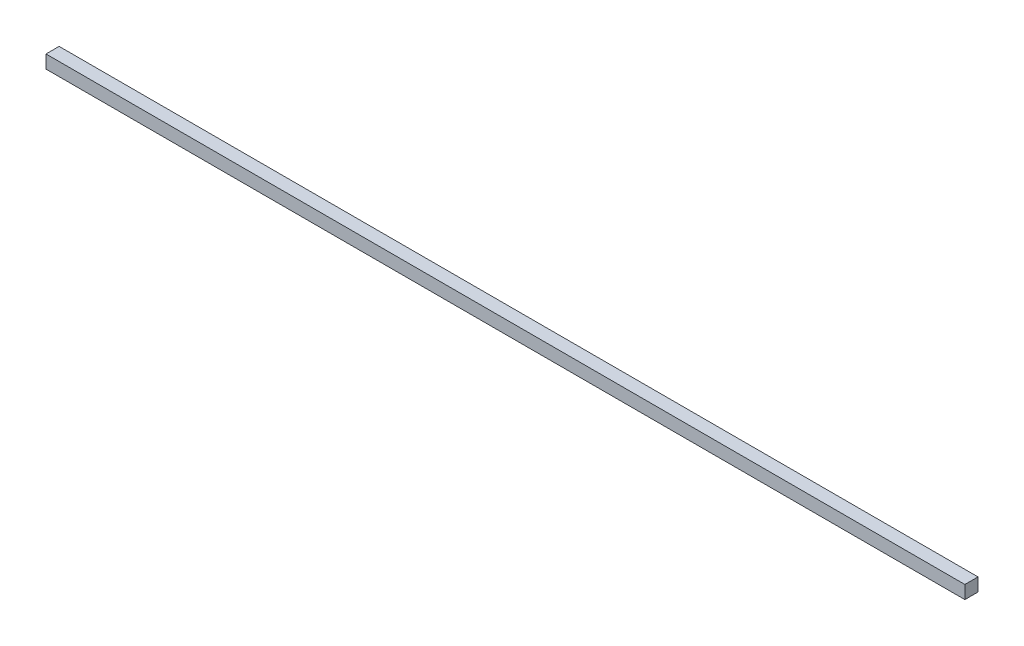
ISO-10303-21;
HEADER;
FILE_DESCRIPTION(('STEP AP214'),'2;1');
FILE_NAME('part.step','',(''),(''),'','','');
FILE_SCHEMA(('AUTOMOTIVE_DESIGN { 1 0 10303 214 1 1 1 1 }'));
ENDSEC;
DATA;
#1=APPLICATION_CONTEXT('core data for automotive mechanical design processes');
#2=APPLICATION_PROTOCOL_DEFINITION('international standard','automotive_design',2000,#1);
#3=PRODUCT_CONTEXT('',#1,'mechanical');
#4=PRODUCT('Part','Part','',(#3));
#5=PRODUCT_RELATED_PRODUCT_CATEGORY('part','',(#4));
#6=PRODUCT_DEFINITION_FORMATION('','',#4);
#7=PRODUCT_DEFINITION_CONTEXT('part definition',#1,'design');
#8=PRODUCT_DEFINITION('design','',#6,#7);
#9=PRODUCT_DEFINITION_SHAPE('','',#8);
#10=(LENGTH_UNIT() NAMED_UNIT(*) SI_UNIT(.MILLI.,.METRE.));
#11=(NAMED_UNIT(*) PLANE_ANGLE_UNIT() SI_UNIT($,.RADIAN.));
#12=(NAMED_UNIT(*) SI_UNIT($,.STERADIAN.) SOLID_ANGLE_UNIT());
#13=UNCERTAINTY_MEASURE_WITH_UNIT(LENGTH_MEASURE(1.E-05),#10,'distance_accuracy_value','');
#14=(GEOMETRIC_REPRESENTATION_CONTEXT(3) GLOBAL_UNCERTAINTY_ASSIGNED_CONTEXT((#13)) GLOBAL_UNIT_ASSIGNED_CONTEXT((#10,
#11,#12)) REPRESENTATION_CONTEXT('',''));
#15=CARTESIAN_POINT('',(0.,0.,0.));
#16=DIRECTION('',(0.,0.,1.));
#17=DIRECTION('',(1.,0.,0.));
#18=AXIS2_PLACEMENT_3D('',#15,#16,#17);
#19=CARTESIAN_POINT('',(-69.9999999999998,2.,1.00000000000001));
#20=DIRECTION('',(1.,0.,0.));
#21=DIRECTION('',(0.,0.,-1.));
#22=AXIS2_PLACEMENT_3D('',#19,#20,#21);
#23=PLANE('',#22);
#24=DIRECTION('',(0.,0.,1.));
#25=VECTOR('',#24,1.);
#26=CARTESIAN_POINT('',(-69.9999999999998,0.,1.00000000000001));
#27=LINE('',#26,#25);
#28=CARTESIAN_POINT('',(-69.9999999999998,0.,-0.999999999999992));
#29=VERTEX_POINT('',#28);
#30=CARTESIAN_POINT('',(-69.9999999999998,0.,1.00000000000001));
#31=VERTEX_POINT('',#30);
#32=EDGE_CURVE('E97',#29,#31,#27,.T.);
#33=ORIENTED_EDGE('',*,*,#32,.T.);
#34=DIRECTION('',(0.,-1.,0.));
#35=VECTOR('',#34,1.);
#36=CARTESIAN_POINT('',(-69.9999999999998,2.,1.00000000000001));
#37=LINE('',#36,#35);
#38=CARTESIAN_POINT('',(-69.9999999999998,2.,1.00000000000001));
#39=VERTEX_POINT('',#38);
#40=EDGE_CURVE('E11',#39,#31,#37,.T.);
#41=ORIENTED_EDGE('',*,*,#40,.F.);
#42=DIRECTION('',(0.,0.,1.));
#43=VECTOR('',#42,1.);
#44=CARTESIAN_POINT('',(-69.9999999999998,2.,1.00000000000001));
#45=LINE('',#44,#43);
#46=CARTESIAN_POINT('',(-69.9999999999998,2.,-0.999999999999992));
#47=VERTEX_POINT('',#46);
#48=EDGE_CURVE('E85',#47,#39,#45,.T.);
#49=ORIENTED_EDGE('',*,*,#48,.F.);
#50=DIRECTION('',(0.,-1.,0.));
#51=VECTOR('',#50,1.);
#52=CARTESIAN_POINT('',(-69.9999999999998,2.,-0.999999999999992));
#53=LINE('',#52,#51);
#54=EDGE_CURVE('E93',#47,#29,#53,.T.);
#55=ORIENTED_EDGE('',*,*,#54,.T.);
#56=EDGE_LOOP('',(#33,#41,#49,#55));
#57=FACE_BOUND('',#56,.T.);
#58=ADVANCED_FACE('F34',(#57),#23,.F.);
#59=CARTESIAN_POINT('',(70.0000000000002,2.,0.999999999999991));
#60=DIRECTION('',(0.,0.,-1.));
#61=DIRECTION('',(-1.,0.,0.));
#62=AXIS2_PLACEMENT_3D('',#59,#60,#61);
#63=PLANE('',#62);
#64=DIRECTION('',(1.,0.,0.));
#65=VECTOR('',#64,1.);
#66=CARTESIAN_POINT('',(70.0000000000002,0.,0.999999999999991));
#67=LINE('',#66,#65);
#68=CARTESIAN_POINT('',(70.0000000000002,0.,0.999999999999991));
#69=VERTEX_POINT('',#68);
#70=EDGE_CURVE('E89',#31,#69,#67,.T.);
#71=ORIENTED_EDGE('',*,*,#70,.T.);
#72=DIRECTION('',(0.,-1.,0.));
#73=VECTOR('',#72,1.);
#74=CARTESIAN_POINT('',(70.0000000000002,2.,0.999999999999991));
#75=LINE('',#74,#73);
#76=CARTESIAN_POINT('',(70.0000000000002,2.,0.999999999999991));
#77=VERTEX_POINT('',#76);
#78=EDGE_CURVE('E42',#77,#69,#75,.T.);
#79=ORIENTED_EDGE('',*,*,#78,.F.);
#80=DIRECTION('',(1.,0.,0.));
#81=VECTOR('',#80,1.);
#82=CARTESIAN_POINT('',(70.0000000000002,2.,0.999999999999991));
#83=LINE('',#82,#81);
#84=EDGE_CURVE('E80',#39,#77,#83,.T.);
#85=ORIENTED_EDGE('',*,*,#84,.F.);
#86=ORIENTED_EDGE('',*,*,#40,.T.);
#87=EDGE_LOOP('',(#71,#79,#85,#86));
#88=FACE_BOUND('',#87,.T.);
#89=ADVANCED_FACE('F88',(#88),#63,.F.);
#90=CARTESIAN_POINT('',(70.0000000000002,2.,0.999999999999991));
#91=DIRECTION('',(-1.,0.,0.));
#92=DIRECTION('',(0.,0.,1.));
#93=AXIS2_PLACEMENT_3D('',#90,#91,#92);
#94=PLANE('',#93);
#95=DIRECTION('',(0.,0.,-1.));
#96=VECTOR('',#95,1.);
#97=CARTESIAN_POINT('',(70.0000000000002,0.,0.999999999999991));
#98=LINE('',#97,#96);
#99=CARTESIAN_POINT('',(70.0000000000002,0.,-1.00000000000001));
#100=VERTEX_POINT('',#99);
#101=EDGE_CURVE('E67',#69,#100,#98,.T.);
#102=ORIENTED_EDGE('',*,*,#101,.T.);
#103=DIRECTION('',(0.,-1.,0.));
#104=VECTOR('',#103,1.);
#105=CARTESIAN_POINT('',(70.0000000000002,2.,-1.00000000000001));
#106=LINE('',#105,#104);
#107=CARTESIAN_POINT('',(70.0000000000002,2.,-1.00000000000001));
#108=VERTEX_POINT('',#107);
#109=EDGE_CURVE('E90',#108,#100,#106,.T.);
#110=ORIENTED_EDGE('',*,*,#109,.F.);
#111=DIRECTION('',(0.,0.,-1.));
#112=VECTOR('',#111,1.);
#113=CARTESIAN_POINT('',(70.0000000000002,2.,0.999999999999991));
#114=LINE('',#113,#112);
#115=EDGE_CURVE('E83',#77,#108,#114,.T.);
#116=ORIENTED_EDGE('',*,*,#115,.F.);
#117=ORIENTED_EDGE('',*,*,#78,.T.);
#118=EDGE_LOOP('',(#102,#110,#116,#117));
#119=FACE_BOUND('',#118,.T.);
#120=ADVANCED_FACE('F91',(#119),#94,.F.);
#121=CARTESIAN_POINT('',(70.0000000000002,2.,-1.00000000000001));
#122=DIRECTION('',(0.,0.,1.));
#123=DIRECTION('',(1.,0.,0.));
#124=AXIS2_PLACEMENT_3D('',#121,#122,#123);
#125=PLANE('',#124);
#126=DIRECTION('',(-1.,0.,0.));
#127=VECTOR('',#126,1.);
#128=CARTESIAN_POINT('',(70.0000000000002,0.,-1.00000000000001));
#129=LINE('',#128,#127);
#130=EDGE_CURVE('E73',#100,#29,#129,.T.);
#131=ORIENTED_EDGE('',*,*,#130,.T.);
#132=ORIENTED_EDGE('',*,*,#54,.F.);
#133=DIRECTION('',(-1.,0.,0.));
#134=VECTOR('',#133,1.);
#135=CARTESIAN_POINT('',(70.0000000000002,2.,-1.00000000000001));
#136=LINE('',#135,#134);
#137=EDGE_CURVE('E50',#108,#47,#136,.T.);
#138=ORIENTED_EDGE('',*,*,#137,.F.);
#139=ORIENTED_EDGE('',*,*,#109,.T.);
#140=EDGE_LOOP('',(#131,#132,#138,#139));
#141=FACE_BOUND('',#140,.T.);
#142=ADVANCED_FACE('F104',(#141),#125,.F.);
#143=CARTESIAN_POINT('',(0.,2.,0.));
#144=DIRECTION('',(0.,1.,0.));
#145=DIRECTION('',(0.,0.,1.));
#146=AXIS2_PLACEMENT_3D('',#143,#144,#145);
#147=PLANE('',#146);
#148=ORIENTED_EDGE('',*,*,#48,.T.);
#149=ORIENTED_EDGE('',*,*,#84,.T.);
#150=ORIENTED_EDGE('',*,*,#115,.T.);
#151=ORIENTED_EDGE('',*,*,#137,.T.);
#152=EDGE_LOOP('',(#148,#149,#150,#151));
#153=FACE_BOUND('',#152,.T.);
#154=ADVANCED_FACE('F81',(#153),#147,.T.);
#155=CARTESIAN_POINT('',(0.,0.,0.));
#156=DIRECTION('',(0.,1.,0.));
#157=DIRECTION('',(0.,0.,1.));
#158=AXIS2_PLACEMENT_3D('',#155,#156,#157);
#159=PLANE('',#158);
#160=ORIENTED_EDGE('',*,*,#32,.F.);
#161=ORIENTED_EDGE('',*,*,#130,.F.);
#162=ORIENTED_EDGE('',*,*,#101,.F.);
#163=ORIENTED_EDGE('',*,*,#70,.F.);
#164=EDGE_LOOP('',(#160,#161,#162,#163));
#165=FACE_BOUND('',#164,.T.);
#166=ADVANCED_FACE('F107',(#165),#159,.F.);
#167=CLOSED_SHELL('',(#58,#89,#120,#142,#154,#166));
#168=MANIFOLD_SOLID_BREP('B2',#167);
#169=ADVANCED_BREP_SHAPE_REPRESENTATION('',(#18,#168),#14);
#170=SHAPE_DEFINITION_REPRESENTATION(#9,#169);
ENDSEC;
END-ISO-10303-21;
